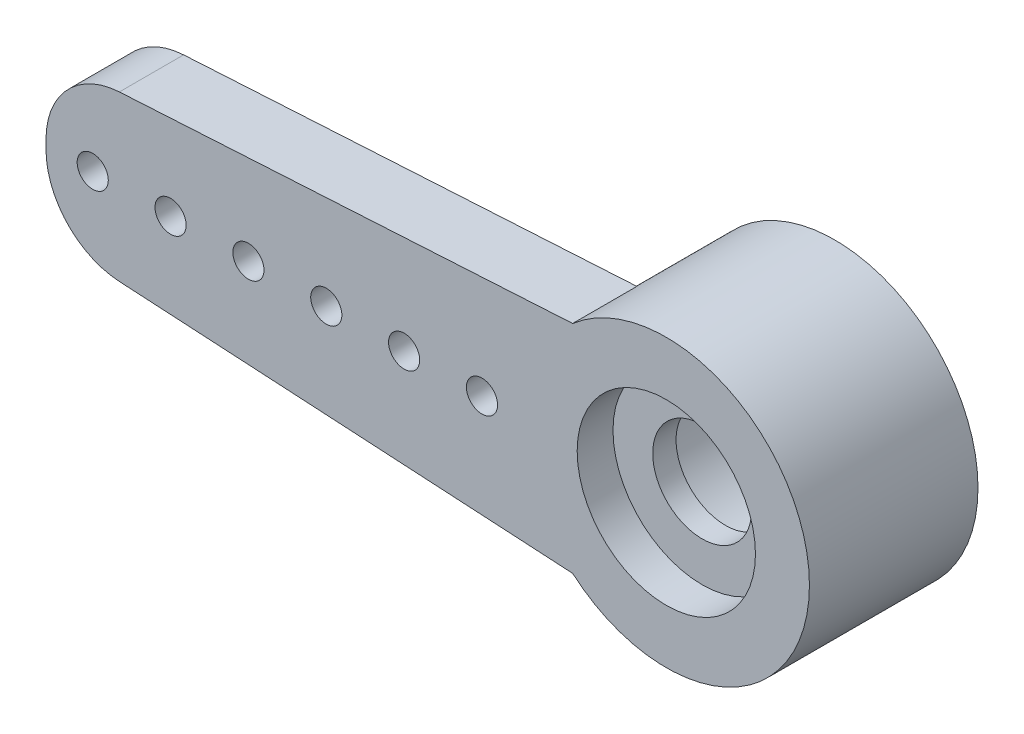
ISO-10303-21;
HEADER;
FILE_DESCRIPTION(('STEP AP214'),'2;1');
FILE_NAME('part.step','',(''),(''),'','','');
FILE_SCHEMA(('AUTOMOTIVE_DESIGN { 1 0 10303 214 1 1 1 1 }'));
ENDSEC;
DATA;
#1=APPLICATION_CONTEXT('core data for automotive mechanical design processes');
#2=APPLICATION_PROTOCOL_DEFINITION('international standard','automotive_design',2000,#1);
#3=PRODUCT_CONTEXT('',#1,'mechanical');
#4=PRODUCT('Part','Part','',(#3));
#5=PRODUCT_RELATED_PRODUCT_CATEGORY('part','',(#4));
#6=PRODUCT_DEFINITION_FORMATION('','',#4);
#7=PRODUCT_DEFINITION_CONTEXT('part definition',#1,'design');
#8=PRODUCT_DEFINITION('design','',#6,#7);
#9=PRODUCT_DEFINITION_SHAPE('','',#8);
#10=(LENGTH_UNIT() NAMED_UNIT(*) SI_UNIT(.MILLI.,.METRE.));
#11=(NAMED_UNIT(*) PLANE_ANGLE_UNIT() SI_UNIT($,.RADIAN.));
#12=(NAMED_UNIT(*) SI_UNIT($,.STERADIAN.) SOLID_ANGLE_UNIT());
#13=UNCERTAINTY_MEASURE_WITH_UNIT(LENGTH_MEASURE(1.E-05),#10,'distance_accuracy_value','');
#14=(GEOMETRIC_REPRESENTATION_CONTEXT(3) GLOBAL_UNCERTAINTY_ASSIGNED_CONTEXT((#13)) GLOBAL_UNIT_ASSIGNED_CONTEXT((#10,
#11,#12)) REPRESENTATION_CONTEXT('',''));
#15=CARTESIAN_POINT('',(0.,0.,0.));
#16=DIRECTION('',(0.,0.,1.));
#17=DIRECTION('',(1.,0.,0.));
#18=AXIS2_PLACEMENT_3D('',#15,#16,#17);
#19=CARTESIAN_POINT('',(0.,0.,4.33));
#20=DIRECTION('',(0.,0.,-1.));
#21=DIRECTION('',(-1.,0.,0.));
#22=AXIS2_PLACEMENT_3D('',#19,#20,#21);
#23=CYLINDRICAL_SURFACE('',#22,3.67665);
#24=CARTESIAN_POINT('',(0.,0.,2.68));
#25=DIRECTION('',(0.,0.,1.));
#26=DIRECTION('',(1.,0.,0.));
#27=AXIS2_PLACEMENT_3D('',#24,#25,#26);
#28=CIRCLE('',#27,3.67665);
#29=CARTESIAN_POINT('',(-2.40610789918075,2.78,2.68));
#30=VERTEX_POINT('',#29);
#31=CARTESIAN_POINT('',(-2.40610789918075,-2.78,2.68));
#32=VERTEX_POINT('',#31);
#33=EDGE_CURVE('E98',#30,#32,#28,.T.);
#34=ORIENTED_EDGE('',*,*,#33,.F.);
#35=DIRECTION('',(0.,0.,1.));
#36=VECTOR('',#35,1.);
#37=CARTESIAN_POINT('',(-2.40610789918075,2.78,2.68));
#38=LINE('',#37,#36);
#39=CARTESIAN_POINT('',(-2.40610789918075,2.78,4.33));
#40=VERTEX_POINT('',#39);
#41=EDGE_CURVE('E110',#30,#40,#38,.T.);
#42=ORIENTED_EDGE('',*,*,#41,.T.);
#43=CARTESIAN_POINT('',(0.,0.,4.33));
#44=DIRECTION('',(0.,0.,1.));
#45=DIRECTION('',(1.,0.,0.));
#46=AXIS2_PLACEMENT_3D('',#43,#44,#45);
#47=CIRCLE('',#46,3.67665);
#48=CARTESIAN_POINT('',(-2.40610789918075,-2.78,4.33));
#49=VERTEX_POINT('',#48);
#50=EDGE_CURVE('E109',#49,#40,#47,.T.);
#51=ORIENTED_EDGE('',*,*,#50,.F.);
#52=DIRECTION('',(0.,0.,1.));
#53=VECTOR('',#52,1.);
#54=CARTESIAN_POINT('',(-2.40610789918075,-2.78,2.68));
#55=LINE('',#54,#53);
#56=EDGE_CURVE('E95',#32,#49,#55,.T.);
#57=ORIENTED_EDGE('',*,*,#56,.F.);
#58=EDGE_LOOP('',(#34,#42,#51,#57));
#59=FACE_BOUND('',#58,.T.);
#60=CARTESIAN_POINT('',(0.,0.,0.));
#61=DIRECTION('',(0.,0.,1.));
#62=DIRECTION('',(1.,0.,0.));
#63=AXIS2_PLACEMENT_3D('',#60,#61,#62);
#64=CIRCLE('',#63,3.67665);
#65=CARTESIAN_POINT('',(3.67665,0.,0.));
#66=VERTEX_POINT('',#65);
#67=EDGE_CURVE('E132',#66,#66,#64,.T.);
#68=ORIENTED_EDGE('',*,*,#67,.T.);
#69=EDGE_LOOP('',(#68));
#70=FACE_BOUND('',#69,.T.);
#71=ADVANCED_FACE('F35',(#59,#70),#23,.T.);
#72=CARTESIAN_POINT('',(0.,0.,4.33));
#73=DIRECTION('',(0.,0.,1.));
#74=DIRECTION('',(1.,0.,0.));
#75=AXIS2_PLACEMENT_3D('',#72,#73,#74);
#76=PLANE('',#75);
#77=CARTESIAN_POINT('',(-4.735,0.,4.33));
#78=DIRECTION('',(0.,0.,1.));
#79=DIRECTION('',(1.,0.,0.));
#80=AXIS2_PLACEMENT_3D('',#77,#78,#79);
#81=CIRCLE('',#80,0.4);
#82=CARTESIAN_POINT('',(-4.335,0.,4.33));
#83=VERTEX_POINT('',#82);
#84=EDGE_CURVE('E178',#83,#83,#81,.T.);
#85=ORIENTED_EDGE('',*,*,#84,.F.);
#86=EDGE_LOOP('',(#85));
#87=FACE_BOUND('',#86,.T.);
#88=CARTESIAN_POINT('',(-6.735,0.,4.33));
#89=DIRECTION('',(0.,0.,1.));
#90=DIRECTION('',(1.,0.,0.));
#91=AXIS2_PLACEMENT_3D('',#88,#89,#90);
#92=CIRCLE('',#91,0.4);
#93=CARTESIAN_POINT('',(-6.335,0.,4.33));
#94=VERTEX_POINT('',#93);
#95=EDGE_CURVE('E168',#94,#94,#92,.T.);
#96=ORIENTED_EDGE('',*,*,#95,.F.);
#97=EDGE_LOOP('',(#96));
#98=FACE_BOUND('',#97,.T.);
#99=CARTESIAN_POINT('',(-8.735,0.,4.33));
#100=DIRECTION('',(0.,0.,1.));
#101=DIRECTION('',(1.,0.,0.));
#102=AXIS2_PLACEMENT_3D('',#99,#100,#101);
#103=CIRCLE('',#102,0.400000000000001);
#104=CARTESIAN_POINT('',(-8.335,0.,4.33));
#105=VERTEX_POINT('',#104);
#106=EDGE_CURVE('E165',#105,#105,#103,.T.);
#107=ORIENTED_EDGE('',*,*,#106,.F.);
#108=EDGE_LOOP('',(#107));
#109=FACE_BOUND('',#108,.T.);
#110=CARTESIAN_POINT('',(-10.735,0.,4.33));
#111=DIRECTION('',(0.,0.,1.));
#112=DIRECTION('',(1.,0.,0.));
#113=AXIS2_PLACEMENT_3D('',#110,#111,#112);
#114=CIRCLE('',#113,0.4);
#115=CARTESIAN_POINT('',(-10.335,0.,4.33));
#116=VERTEX_POINT('',#115);
#117=EDGE_CURVE('E162',#116,#116,#114,.T.);
#118=ORIENTED_EDGE('',*,*,#117,.F.);
#119=EDGE_LOOP('',(#118));
#120=FACE_BOUND('',#119,.T.);
#121=CARTESIAN_POINT('',(-12.735,0.,4.33));
#122=DIRECTION('',(0.,0.,1.));
#123=DIRECTION('',(1.,0.,0.));
#124=AXIS2_PLACEMENT_3D('',#121,#122,#123);
#125=CIRCLE('',#124,0.4);
#126=CARTESIAN_POINT('',(-12.335,0.,4.33));
#127=VERTEX_POINT('',#126);
#128=EDGE_CURVE('E158',#127,#127,#125,.T.);
#129=ORIENTED_EDGE('',*,*,#128,.F.);
#130=EDGE_LOOP('',(#129));
#131=FACE_BOUND('',#130,.T.);
#132=CARTESIAN_POINT('',(-14.735,0.,4.33));
#133=DIRECTION('',(0.,0.,1.));
#134=DIRECTION('',(1.,0.,0.));
#135=AXIS2_PLACEMENT_3D('',#132,#133,#134);
#136=CIRCLE('',#135,0.4);
#137=CARTESIAN_POINT('',(-14.335,0.,4.33));
#138=VERTEX_POINT('',#137);
#139=EDGE_CURVE('E154',#138,#138,#136,.T.);
#140=ORIENTED_EDGE('',*,*,#139,.F.);
#141=EDGE_LOOP('',(#140));
#142=FACE_BOUND('',#141,.T.);
#143=CARTESIAN_POINT('',(0.,0.,4.33));
#144=DIRECTION('',(0.,0.,1.));
#145=DIRECTION('',(1.,0.,0.));
#146=AXIS2_PLACEMENT_3D('',#143,#144,#145);
#147=CIRCLE('',#146,2.29);
#148=CARTESIAN_POINT('',(2.29,0.,4.33));
#149=VERTEX_POINT('',#148);
#150=EDGE_CURVE('E122',#149,#149,#147,.T.);
#151=ORIENTED_EDGE('',*,*,#150,.F.);
#152=EDGE_LOOP('',(#151));
#153=FACE_BOUND('',#152,.T.);
#154=DIRECTION('',(0.,-1.,0.));
#155=VECTOR('',#154,1.);
#156=CARTESIAN_POINT('',(-15.935,0.,4.33));
#157=LINE('',#156,#155);
#158=CARTESIAN_POINT('',(-15.935,0.111987506035679,4.33));
#159=VERTEX_POINT('',#158);
#160=CARTESIAN_POINT('',(-15.935,-0.111987506035682,4.33));
#161=VERTEX_POINT('',#160);
#162=EDGE_CURVE('E153',#159,#161,#157,.T.);
#163=ORIENTED_EDGE('',*,*,#162,.T.);
#164=CARTESIAN_POINT('',(-13.935,-0.111987506035682,4.33));
#165=DIRECTION('',(0.,0.,1.));
#166=DIRECTION('',(1.,0.,0.));
#167=AXIS2_PLACEMENT_3D('',#164,#165,#166);
#168=CIRCLE('',#167,2.);
#169=CARTESIAN_POINT('',(-14.0501176084538,-2.10867174151807,4.33));
#170=VERTEX_POINT('',#169);
#171=EDGE_CURVE('E145',#161,#170,#168,.T.);
#172=ORIENTED_EDGE('',*,*,#171,.T.);
#173=DIRECTION('',(0.998342117741192,-0.0575588042269161,0.));
#174=VECTOR('',#173,1.);
#175=CARTESIAN_POINT('',(-0.167719666081258,-2.90905290461381,4.33));
#176=LINE('',#175,#174);
#177=EDGE_CURVE('E192',#170,#49,#176,.T.);
#178=ORIENTED_EDGE('',*,*,#177,.T.);
#179=ORIENTED_EDGE('',*,*,#50,.T.);
#180=DIRECTION('',(-0.998342117741192,-0.0575588042269164,0.));
#181=VECTOR('',#180,1.);
#182=CARTESIAN_POINT('',(-0.167719666081259,2.90905290461381,4.33));
#183=LINE('',#182,#181);
#184=CARTESIAN_POINT('',(-14.0501176084538,2.10867174151806,4.33));
#185=VERTEX_POINT('',#184);
#186=EDGE_CURVE('E188',#40,#185,#183,.T.);
#187=ORIENTED_EDGE('',*,*,#186,.T.);
#188=CARTESIAN_POINT('',(-13.935,0.111987506035679,4.33));
#189=DIRECTION('',(0.,0.,1.));
#190=DIRECTION('',(1.,0.,0.));
#191=AXIS2_PLACEMENT_3D('',#188,#189,#190);
#192=CIRCLE('',#191,2.);
#193=EDGE_CURVE('E143',#185,#159,#192,.T.);
#194=ORIENTED_EDGE('',*,*,#193,.T.);
#195=EDGE_LOOP('',(#163,#172,#178,#179,#187,#194));
#196=FACE_BOUND('',#195,.T.);
#197=ADVANCED_FACE('F195',(#87,#98,#109,#120,#131,#142,#153,#196),#76,.T.);
#198=CARTESIAN_POINT('',(0.,0.,0.));
#199=DIRECTION('',(0.,0.,1.));
#200=DIRECTION('',(1.,0.,0.));
#201=AXIS2_PLACEMENT_3D('',#198,#199,#200);
#202=PLANE('',#201);
#203=CARTESIAN_POINT('',(0.,0.,0.));
#204=DIRECTION('',(0.,0.,-1.));
#205=DIRECTION('',(-1.,0.,0.));
#206=AXIS2_PLACEMENT_3D('',#203,#204,#205);
#207=CIRCLE('',#206,2.235);
#208=CARTESIAN_POINT('',(-2.235,0.,0.));
#209=VERTEX_POINT('',#208);
#210=EDGE_CURVE('E126',#209,#209,#207,.T.);
#211=ORIENTED_EDGE('',*,*,#210,.F.);
#212=EDGE_LOOP('',(#211));
#213=FACE_BOUND('',#212,.T.);
#214=ORIENTED_EDGE('',*,*,#67,.F.);
#215=EDGE_LOOP('',(#214));
#216=FACE_BOUND('',#215,.T.);
#217=ADVANCED_FACE('F220',(#213,#216),#202,.F.);
#218=CARTESIAN_POINT('',(0.,0.,2.81));
#219=DIRECTION('',(0.,0.,-1.));
#220=DIRECTION('',(-1.,0.,0.));
#221=AXIS2_PLACEMENT_3D('',#218,#219,#220);
#222=CYLINDRICAL_SURFACE('',#221,2.235);
#223=CARTESIAN_POINT('',(0.,0.,2.81));
#224=DIRECTION('',(0.,0.,-1.));
#225=DIRECTION('',(-1.,0.,0.));
#226=AXIS2_PLACEMENT_3D('',#223,#224,#225);
#227=CIRCLE('',#226,2.235);
#228=CARTESIAN_POINT('',(-2.235,0.,2.81));
#229=VERTEX_POINT('',#228);
#230=EDGE_CURVE('E129',#229,#229,#227,.T.);
#231=ORIENTED_EDGE('',*,*,#230,.F.);
#232=EDGE_LOOP('',(#231));
#233=FACE_BOUND('',#232,.T.);
#234=ORIENTED_EDGE('',*,*,#210,.T.);
#235=EDGE_LOOP('',(#234));
#236=FACE_BOUND('',#235,.T.);
#237=ADVANCED_FACE('F225',(#233,#236),#222,.F.);
#238=CARTESIAN_POINT('',(0.,0.,2.81));
#239=DIRECTION('',(0.,0.,-1.));
#240=DIRECTION('',(-1.,0.,0.));
#241=AXIS2_PLACEMENT_3D('',#238,#239,#240);
#242=PLANE('',#241);
#243=CARTESIAN_POINT('',(0.,0.,2.81));
#244=DIRECTION('',(0.,0.,-1.));
#245=DIRECTION('',(-1.,0.,0.));
#246=AXIS2_PLACEMENT_3D('',#243,#244,#245);
#247=CIRCLE('',#246,1.27);
#248=CARTESIAN_POINT('',(1.27,0.,2.81));
#249=VERTEX_POINT('',#248);
#250=EDGE_CURVE('E119',#249,#249,#247,.T.);
#251=ORIENTED_EDGE('',*,*,#250,.F.);
#252=EDGE_LOOP('',(#251));
#253=FACE_BOUND('',#252,.T.);
#254=ORIENTED_EDGE('',*,*,#230,.T.);
#255=EDGE_LOOP('',(#254));
#256=FACE_BOUND('',#255,.T.);
#257=ADVANCED_FACE('F230',(#253,#256),#242,.T.);
#258=CARTESIAN_POINT('',(0.,0.,3.41));
#259=DIRECTION('',(0.,0.,1.));
#260=DIRECTION('',(1.,0.,0.));
#261=AXIS2_PLACEMENT_3D('',#258,#259,#260);
#262=CYLINDRICAL_SURFACE('',#261,2.29);
#263=CARTESIAN_POINT('',(0.,0.,3.41));
#264=DIRECTION('',(0.,0.,1.));
#265=DIRECTION('',(1.,0.,0.));
#266=AXIS2_PLACEMENT_3D('',#263,#264,#265);
#267=CIRCLE('',#266,2.29);
#268=CARTESIAN_POINT('',(2.29,0.,3.41));
#269=VERTEX_POINT('',#268);
#270=EDGE_CURVE('E123',#269,#269,#267,.T.);
#271=ORIENTED_EDGE('',*,*,#270,.F.);
#272=EDGE_LOOP('',(#271));
#273=FACE_BOUND('',#272,.T.);
#274=ORIENTED_EDGE('',*,*,#150,.T.);
#275=EDGE_LOOP('',(#274));
#276=FACE_BOUND('',#275,.T.);
#277=ADVANCED_FACE('F234',(#273,#276),#262,.F.);
#278=CARTESIAN_POINT('',(0.,0.,3.41));
#279=DIRECTION('',(0.,0.,1.));
#280=DIRECTION('',(1.,0.,0.));
#281=AXIS2_PLACEMENT_3D('',#278,#279,#280);
#282=PLANE('',#281);
#283=CARTESIAN_POINT('',(0.,0.,3.41));
#284=DIRECTION('',(0.,0.,1.));
#285=DIRECTION('',(1.,0.,0.));
#286=AXIS2_PLACEMENT_3D('',#283,#284,#285);
#287=CIRCLE('',#286,1.27);
#288=CARTESIAN_POINT('',(1.27,0.,3.41));
#289=VERTEX_POINT('',#288);
#290=EDGE_CURVE('E112',#289,#289,#287,.T.);
#291=ORIENTED_EDGE('',*,*,#290,.F.);
#292=EDGE_LOOP('',(#291));
#293=FACE_BOUND('',#292,.T.);
#294=ORIENTED_EDGE('',*,*,#270,.T.);
#295=EDGE_LOOP('',(#294));
#296=FACE_BOUND('',#295,.T.);
#297=ADVANCED_FACE('F238',(#293,#296),#282,.T.);
#298=CARTESIAN_POINT('',(0.,0.,0.));
#299=DIRECTION('',(0.,0.,1.));
#300=DIRECTION('',(1.,0.,0.));
#301=AXIS2_PLACEMENT_3D('',#298,#299,#300);
#302=CYLINDRICAL_SURFACE('',#301,1.27);
#303=CARTESIAN_POINT('',(1.27,0.,2.81));
#304=CARTESIAN_POINT('',(1.27,0.,2.81625));
#305=CARTESIAN_POINT('',(1.27,0.,2.8225));
#306=CARTESIAN_POINT('',(1.27,0.,2.835));
#307=CARTESIAN_POINT('',(1.27,0.,2.84125));
#308=CARTESIAN_POINT('',(1.27,0.,2.85375));
#309=CARTESIAN_POINT('',(1.27,0.,2.86));
#310=CARTESIAN_POINT('',(1.27,0.,2.8725));
#311=CARTESIAN_POINT('',(1.27,0.,2.87875));
#312=CARTESIAN_POINT('',(1.27,0.,2.89125));
#313=CARTESIAN_POINT('',(1.27,0.,2.8975));
#314=CARTESIAN_POINT('',(1.27,0.,2.91));
#315=CARTESIAN_POINT('',(1.27,0.,2.91625));
#316=CARTESIAN_POINT('',(1.27,0.,2.92875));
#317=CARTESIAN_POINT('',(1.27,0.,2.935));
#318=CARTESIAN_POINT('',(1.27,0.,2.9475));
#319=CARTESIAN_POINT('',(1.27,0.,2.95375));
#320=CARTESIAN_POINT('',(1.27,0.,2.96625));
#321=CARTESIAN_POINT('',(1.27,0.,2.9725));
#322=CARTESIAN_POINT('',(1.27,0.,2.985));
#323=CARTESIAN_POINT('',(1.27,0.,2.99125));
#324=CARTESIAN_POINT('',(1.27,0.,3.00375));
#325=CARTESIAN_POINT('',(1.27,0.,3.01));
#326=CARTESIAN_POINT('',(1.27,0.,3.0225));
#327=CARTESIAN_POINT('',(1.27,0.,3.02875));
#328=CARTESIAN_POINT('',(1.27,0.,3.04125));
#329=CARTESIAN_POINT('',(1.27,0.,3.0475));
#330=CARTESIAN_POINT('',(1.27,0.,3.06));
#331=CARTESIAN_POINT('',(1.27,0.,3.06625));
#332=CARTESIAN_POINT('',(1.27,0.,3.07875));
#333=CARTESIAN_POINT('',(1.27,0.,3.085));
#334=CARTESIAN_POINT('',(1.27,0.,3.0975));
#335=CARTESIAN_POINT('',(1.27,0.,3.10375));
#336=CARTESIAN_POINT('',(1.27,0.,3.11625));
#337=CARTESIAN_POINT('',(1.27,0.,3.1225));
#338=CARTESIAN_POINT('',(1.27,0.,3.135));
#339=CARTESIAN_POINT('',(1.27,0.,3.14125));
#340=CARTESIAN_POINT('',(1.27,0.,3.15375));
#341=CARTESIAN_POINT('',(1.27,0.,3.16));
#342=CARTESIAN_POINT('',(1.27,0.,3.1725));
#343=CARTESIAN_POINT('',(1.27,0.,3.17875));
#344=CARTESIAN_POINT('',(1.27,0.,3.19125));
#345=CARTESIAN_POINT('',(1.27,0.,3.1975));
#346=CARTESIAN_POINT('',(1.27,0.,3.21));
#347=CARTESIAN_POINT('',(1.27,0.,3.21625));
#348=CARTESIAN_POINT('',(1.27,0.,3.22875));
#349=CARTESIAN_POINT('',(1.27,0.,3.235));
#350=CARTESIAN_POINT('',(1.27,0.,3.2475));
#351=CARTESIAN_POINT('',(1.27,0.,3.25375));
#352=CARTESIAN_POINT('',(1.27,0.,3.26625));
#353=CARTESIAN_POINT('',(1.27,0.,3.2725));
#354=CARTESIAN_POINT('',(1.27,0.,3.285));
#355=CARTESIAN_POINT('',(1.27,0.,3.29125));
#356=CARTESIAN_POINT('',(1.27,0.,3.30375));
#357=CARTESIAN_POINT('',(1.27,0.,3.31));
#358=CARTESIAN_POINT('',(1.27,0.,3.3225));
#359=CARTESIAN_POINT('',(1.27,0.,3.32875));
#360=CARTESIAN_POINT('',(1.27,0.,3.34125));
#361=CARTESIAN_POINT('',(1.27,0.,3.3475));
#362=CARTESIAN_POINT('',(1.27,0.,3.36));
#363=CARTESIAN_POINT('',(1.27,0.,3.36625));
#364=CARTESIAN_POINT('',(1.27,0.,3.37875));
#365=CARTESIAN_POINT('',(1.27,0.,3.385));
#366=CARTESIAN_POINT('',(1.27,0.,3.3975));
#367=CARTESIAN_POINT('',(1.27,0.,3.40375));
#368=CARTESIAN_POINT('',(1.27,0.,3.41));
#369=B_SPLINE_CURVE_WITH_KNOTS('',3,(#303,#304,#305,#306,#307,#308,#309,#310,#311,#312,#313,
#314,#315,#316,#317,#318,#319,#320,#321,#322,#323,#324,#325,#326,#327,#328,#329,#330,#331,#332,
#333,#334,#335,#336,#337,#338,#339,#340,#341,#342,#343,#344,#345,#346,#347,#348,#349,#350,#351,
#352,#353,#354,#355,#356,#357,#358,#359,#360,#361,#362,#363,#364,#365,#366,#367,#368),
.UNSPECIFIED.,.F.,.F.,(4,2,2,2,2,2,2,2,2,2,2,2,2,2,2,2,2,2,2,2,2,2,2,2,2,2,2,2,2,2,2,2,4),(0.,
0.0187500000000001,0.0374999999999998,0.0562499999999999,0.075,0.0937499999999997,0.1125,
0.13125,0.15,0.16875,0.1875,0.20625,0.225,0.24375,0.2625,0.281249999999999,0.299999999999999,
0.31875,0.337499999999999,0.356249999999999,0.374999999999999,0.393749999999999,
0.412499999999999,0.431249999999999,0.449999999999999,0.468749999999999,0.487499999999999,
0.506249999999999,0.524999999999999,0.543749999999999,0.562499999999999,0.581249999999999,
0.599999999999999),.UNSPECIFIED.);
#370=EDGE_CURVE('BSEAM242',#249,#289,#369,.T.);
#371=ORIENTED_EDGE('',*,*,#250,.T.);
#372=ORIENTED_EDGE('',*,*,#290,.T.);
#373=ORIENTED_EDGE('',*,*,#370,.T.);
#374=ORIENTED_EDGE('',*,*,#370,.F.);
#375=EDGE_LOOP('',(#371,#373,#372,#374));
#376=FACE_BOUND('',#375,.T.);
#377=ADVANCED_FACE('F242',(#376),#302,.F.);
#378=CARTESIAN_POINT('',(-15.935,0.,2.68));
#379=DIRECTION('',(-1.,0.,0.));
#380=DIRECTION('',(0.,0.,1.));
#381=AXIS2_PLACEMENT_3D('',#378,#379,#380);
#382=PLANE('',#381);
#383=DIRECTION('',(0.,-1.,0.));
#384=VECTOR('',#383,1.);
#385=CARTESIAN_POINT('',(-15.935,0.,2.68));
#386=LINE('',#385,#384);
#387=CARTESIAN_POINT('',(-15.935,0.111987506035679,2.68));
#388=VERTEX_POINT('',#387);
#389=CARTESIAN_POINT('',(-15.935,-0.111987506035682,2.68));
#390=VERTEX_POINT('',#389);
#391=EDGE_CURVE('E99',#388,#390,#386,.T.);
#392=ORIENTED_EDGE('',*,*,#391,.T.);
#393=DIRECTION('',(0.,0.,1.));
#394=VECTOR('',#393,1.);
#395=CARTESIAN_POINT('',(-15.935,-0.111987506035682,2.68));
#396=LINE('',#395,#394);
#397=EDGE_CURVE('E140',#390,#161,#396,.T.);
#398=ORIENTED_EDGE('',*,*,#397,.T.);
#399=ORIENTED_EDGE('',*,*,#162,.F.);
#400=DIRECTION('',(0.,0.,1.));
#401=VECTOR('',#400,1.);
#402=CARTESIAN_POINT('',(-15.935,0.111987506035679,2.68));
#403=LINE('',#402,#401);
#404=EDGE_CURVE('E136',#159,#388,#403,.F.);
#405=ORIENTED_EDGE('',*,*,#404,.T.);
#406=EDGE_LOOP('',(#392,#398,#399,#405));
#407=FACE_BOUND('',#406,.T.);
#408=ADVANCED_FACE('F203',(#407),#382,.T.);
#409=CARTESIAN_POINT('',(-0.167719666081259,2.90905290461381,2.68));
#410=DIRECTION('',(-0.0575588042269164,0.998342117741192,0.));
#411=DIRECTION('',(-0.998342117741192,-0.0575588042269164,0.));
#412=AXIS2_PLACEMENT_3D('',#409,#410,#411);
#413=PLANE('',#412);
#414=DIRECTION('',(-0.998342117741192,-0.0575588042269164,0.));
#415=VECTOR('',#414,1.);
#416=CARTESIAN_POINT('',(-0.167719666081259,2.90905290461381,2.68));
#417=LINE('',#416,#415);
#418=CARTESIAN_POINT('',(-14.0501176084538,2.10867174151806,2.68));
#419=VERTEX_POINT('',#418);
#420=EDGE_CURVE('E103',#30,#419,#417,.T.);
#421=ORIENTED_EDGE('',*,*,#420,.T.);
#422=DIRECTION('',(0.,0.,1.));
#423=VECTOR('',#422,1.);
#424=CARTESIAN_POINT('',(-14.0501176084538,2.10867174151806,2.68));
#425=LINE('',#424,#423);
#426=EDGE_CURVE('E11',#419,#185,#425,.T.);
#427=ORIENTED_EDGE('',*,*,#426,.T.);
#428=ORIENTED_EDGE('',*,*,#186,.F.);
#429=ORIENTED_EDGE('',*,*,#41,.F.);
#430=EDGE_LOOP('',(#421,#427,#428,#429));
#431=FACE_BOUND('',#430,.T.);
#432=ADVANCED_FACE('F198',(#431),#413,.T.);
#433=CARTESIAN_POINT('',(-0.167719666081258,-2.90905290461381,2.68));
#434=DIRECTION('',(-0.0575588042269161,-0.998342117741192,0.));
#435=DIRECTION('',(0.998342117741192,-0.0575588042269161,0.));
#436=AXIS2_PLACEMENT_3D('',#433,#434,#435);
#437=PLANE('',#436);
#438=ORIENTED_EDGE('',*,*,#177,.F.);
#439=DIRECTION('',(0.,0.,1.));
#440=VECTOR('',#439,1.);
#441=CARTESIAN_POINT('',(-14.0501176084538,-2.10867174151807,2.68));
#442=LINE('',#441,#440);
#443=CARTESIAN_POINT('',(-14.0501176084538,-2.10867174151807,2.68));
#444=VERTEX_POINT('',#443);
#445=EDGE_CURVE('E60',#170,#444,#442,.F.);
#446=ORIENTED_EDGE('',*,*,#445,.T.);
#447=DIRECTION('',(0.998342117741192,-0.0575588042269161,0.));
#448=VECTOR('',#447,1.);
#449=CARTESIAN_POINT('',(-0.167719666081258,-2.90905290461381,2.68));
#450=LINE('',#449,#448);
#451=EDGE_CURVE('E91',#444,#32,#450,.T.);
#452=ORIENTED_EDGE('',*,*,#451,.T.);
#453=ORIENTED_EDGE('',*,*,#56,.T.);
#454=EDGE_LOOP('',(#438,#446,#452,#453));
#455=FACE_BOUND('',#454,.T.);
#456=ADVANCED_FACE('F93',(#455),#437,.T.);
#457=CARTESIAN_POINT('',(0.,0.,2.68));
#458=DIRECTION('',(0.,0.,1.));
#459=DIRECTION('',(1.,0.,0.));
#460=AXIS2_PLACEMENT_3D('',#457,#458,#459);
#461=PLANE('',#460);
#462=CARTESIAN_POINT('',(-4.735,0.,2.68));
#463=DIRECTION('',(0.,0.,1.));
#464=DIRECTION('',(1.,0.,0.));
#465=AXIS2_PLACEMENT_3D('',#462,#463,#464);
#466=CIRCLE('',#465,0.4);
#467=CARTESIAN_POINT('',(-4.335,0.,2.68));
#468=VERTEX_POINT('',#467);
#469=EDGE_CURVE('E39',#468,#468,#466,.T.);
#470=ORIENTED_EDGE('',*,*,#469,.T.);
#471=EDGE_LOOP('',(#470));
#472=FACE_BOUND('',#471,.T.);
#473=CARTESIAN_POINT('',(-6.735,0.,2.68));
#474=DIRECTION('',(0.,0.,1.));
#475=DIRECTION('',(1.,0.,0.));
#476=AXIS2_PLACEMENT_3D('',#473,#474,#475);
#477=CIRCLE('',#476,0.4);
#478=CARTESIAN_POINT('',(-6.335,0.,2.68));
#479=VERTEX_POINT('',#478);
#480=EDGE_CURVE('E166',#479,#479,#477,.T.);
#481=ORIENTED_EDGE('',*,*,#480,.T.);
#482=EDGE_LOOP('',(#481));
#483=FACE_BOUND('',#482,.T.);
#484=CARTESIAN_POINT('',(-8.735,0.,2.68));
#485=DIRECTION('',(0.,0.,1.));
#486=DIRECTION('',(1.,0.,0.));
#487=AXIS2_PLACEMENT_3D('',#484,#485,#486);
#488=CIRCLE('',#487,0.400000000000001);
#489=CARTESIAN_POINT('',(-8.335,0.,2.68));
#490=VERTEX_POINT('',#489);
#491=EDGE_CURVE('E163',#490,#490,#488,.T.);
#492=ORIENTED_EDGE('',*,*,#491,.T.);
#493=EDGE_LOOP('',(#492));
#494=FACE_BOUND('',#493,.T.);
#495=CARTESIAN_POINT('',(-10.735,0.,2.68));
#496=DIRECTION('',(0.,0.,1.));
#497=DIRECTION('',(1.,0.,0.));
#498=AXIS2_PLACEMENT_3D('',#495,#496,#497);
#499=CIRCLE('',#498,0.4);
#500=CARTESIAN_POINT('',(-10.335,0.,2.68));
#501=VERTEX_POINT('',#500);
#502=EDGE_CURVE('E159',#501,#501,#499,.T.);
#503=ORIENTED_EDGE('',*,*,#502,.T.);
#504=EDGE_LOOP('',(#503));
#505=FACE_BOUND('',#504,.T.);
#506=CARTESIAN_POINT('',(-12.735,0.,2.68));
#507=DIRECTION('',(0.,0.,1.));
#508=DIRECTION('',(1.,0.,0.));
#509=AXIS2_PLACEMENT_3D('',#506,#507,#508);
#510=CIRCLE('',#509,0.4);
#511=CARTESIAN_POINT('',(-12.335,0.,2.68));
#512=VERTEX_POINT('',#511);
#513=EDGE_CURVE('E155',#512,#512,#510,.T.);
#514=ORIENTED_EDGE('',*,*,#513,.T.);
#515=EDGE_LOOP('',(#514));
#516=FACE_BOUND('',#515,.T.);
#517=CARTESIAN_POINT('',(-14.735,0.,2.68));
#518=DIRECTION('',(0.,0.,1.));
#519=DIRECTION('',(1.,0.,0.));
#520=AXIS2_PLACEMENT_3D('',#517,#518,#519);
#521=CIRCLE('',#520,0.4);
#522=CARTESIAN_POINT('',(-14.335,0.,2.68));
#523=VERTEX_POINT('',#522);
#524=EDGE_CURVE('E150',#523,#523,#521,.T.);
#525=ORIENTED_EDGE('',*,*,#524,.T.);
#526=EDGE_LOOP('',(#525));
#527=FACE_BOUND('',#526,.T.);
#528=ORIENTED_EDGE('',*,*,#451,.F.);
#529=CARTESIAN_POINT('',(-13.935,-0.111987506035682,2.68));
#530=DIRECTION('',(0.,0.,1.));
#531=DIRECTION('',(1.,0.,0.));
#532=AXIS2_PLACEMENT_3D('',#529,#530,#531);
#533=CIRCLE('',#532,2.);
#534=EDGE_CURVE('E44',#444,#390,#533,.F.);
#535=ORIENTED_EDGE('',*,*,#534,.T.);
#536=ORIENTED_EDGE('',*,*,#391,.F.);
#537=CARTESIAN_POINT('',(-13.935,0.111987506035679,2.68));
#538=DIRECTION('',(0.,0.,1.));
#539=DIRECTION('',(1.,0.,0.));
#540=AXIS2_PLACEMENT_3D('',#537,#538,#539);
#541=CIRCLE('',#540,2.);
#542=EDGE_CURVE('E52',#388,#419,#541,.F.);
#543=ORIENTED_EDGE('',*,*,#542,.T.);
#544=ORIENTED_EDGE('',*,*,#420,.F.);
#545=ORIENTED_EDGE('',*,*,#33,.T.);
#546=EDGE_LOOP('',(#528,#535,#536,#543,#544,#545));
#547=FACE_BOUND('',#546,.T.);
#548=ADVANCED_FACE('F102',(#472,#483,#494,#505,#516,#527,#547),#461,.F.);
#549=CARTESIAN_POINT('',(-13.935,-0.111987506035682,2.68));
#550=DIRECTION('',(0.,0.,1.));
#551=DIRECTION('',(1.,0.,0.));
#552=AXIS2_PLACEMENT_3D('',#549,#550,#551);
#553=CYLINDRICAL_SURFACE('',#552,2.);
#554=ORIENTED_EDGE('',*,*,#534,.F.);
#555=ORIENTED_EDGE('',*,*,#445,.F.);
#556=ORIENTED_EDGE('',*,*,#171,.F.);
#557=ORIENTED_EDGE('',*,*,#397,.F.);
#558=EDGE_LOOP('',(#554,#555,#556,#557));
#559=FACE_BOUND('',#558,.T.);
#560=ADVANCED_FACE('F206',(#559),#553,.T.);
#561=CARTESIAN_POINT('',(-13.935,0.111987506035679,2.68));
#562=DIRECTION('',(0.,0.,1.));
#563=DIRECTION('',(1.,0.,0.));
#564=AXIS2_PLACEMENT_3D('',#561,#562,#563);
#565=CYLINDRICAL_SURFACE('',#564,2.);
#566=ORIENTED_EDGE('',*,*,#542,.F.);
#567=ORIENTED_EDGE('',*,*,#404,.F.);
#568=ORIENTED_EDGE('',*,*,#193,.F.);
#569=ORIENTED_EDGE('',*,*,#426,.F.);
#570=EDGE_LOOP('',(#566,#567,#568,#569));
#571=FACE_BOUND('',#570,.T.);
#572=ADVANCED_FACE('F37',(#571),#565,.T.);
#573=CARTESIAN_POINT('',(-14.735,0.,0.));
#574=DIRECTION('',(0.,0.,1.));
#575=DIRECTION('',(1.,0.,0.));
#576=AXIS2_PLACEMENT_3D('',#573,#574,#575);
#577=CYLINDRICAL_SURFACE('',#576,0.4);
#578=ORIENTED_EDGE('',*,*,#139,.T.);
#579=EDGE_LOOP('',(#578));
#580=FACE_BOUND('',#579,.T.);
#581=ORIENTED_EDGE('',*,*,#524,.F.);
#582=EDGE_LOOP('',(#581));
#583=FACE_BOUND('',#582,.T.);
#584=ADVANCED_FACE('F212',(#580,#583),#577,.F.);
#585=CARTESIAN_POINT('',(-12.735,0.,0.));
#586=DIRECTION('',(0.,0.,1.));
#587=DIRECTION('',(1.,0.,0.));
#588=AXIS2_PLACEMENT_3D('',#585,#586,#587);
#589=CYLINDRICAL_SURFACE('',#588,0.4);
#590=ORIENTED_EDGE('',*,*,#128,.T.);
#591=EDGE_LOOP('',(#590));
#592=FACE_BOUND('',#591,.T.);
#593=ORIENTED_EDGE('',*,*,#513,.F.);
#594=EDGE_LOOP('',(#593));
#595=FACE_BOUND('',#594,.T.);
#596=ADVANCED_FACE('F255',(#592,#595),#589,.F.);
#597=CARTESIAN_POINT('',(-10.735,0.,0.));
#598=DIRECTION('',(0.,0.,1.));
#599=DIRECTION('',(1.,0.,0.));
#600=AXIS2_PLACEMENT_3D('',#597,#598,#599);
#601=CYLINDRICAL_SURFACE('',#600,0.4);
#602=ORIENTED_EDGE('',*,*,#117,.T.);
#603=EDGE_LOOP('',(#602));
#604=FACE_BOUND('',#603,.T.);
#605=ORIENTED_EDGE('',*,*,#502,.F.);
#606=EDGE_LOOP('',(#605));
#607=FACE_BOUND('',#606,.T.);
#608=ADVANCED_FACE('F259',(#604,#607),#601,.F.);
#609=CARTESIAN_POINT('',(-8.735,0.,0.));
#610=DIRECTION('',(0.,0.,1.));
#611=DIRECTION('',(1.,0.,0.));
#612=AXIS2_PLACEMENT_3D('',#609,#610,#611);
#613=CYLINDRICAL_SURFACE('',#612,0.400000000000001);
#614=ORIENTED_EDGE('',*,*,#106,.T.);
#615=EDGE_LOOP('',(#614));
#616=FACE_BOUND('',#615,.T.);
#617=ORIENTED_EDGE('',*,*,#491,.F.);
#618=EDGE_LOOP('',(#617));
#619=FACE_BOUND('',#618,.T.);
#620=ADVANCED_FACE('F263',(#616,#619),#613,.F.);
#621=CARTESIAN_POINT('',(-6.735,0.,0.));
#622=DIRECTION('',(0.,0.,1.));
#623=DIRECTION('',(1.,0.,0.));
#624=AXIS2_PLACEMENT_3D('',#621,#622,#623);
#625=CYLINDRICAL_SURFACE('',#624,0.4);
#626=ORIENTED_EDGE('',*,*,#95,.T.);
#627=EDGE_LOOP('',(#626));
#628=FACE_BOUND('',#627,.T.);
#629=ORIENTED_EDGE('',*,*,#480,.F.);
#630=EDGE_LOOP('',(#629));
#631=FACE_BOUND('',#630,.T.);
#632=ADVANCED_FACE('F267',(#628,#631),#625,.F.);
#633=CARTESIAN_POINT('',(-4.735,0.,0.));
#634=DIRECTION('',(0.,0.,1.));
#635=DIRECTION('',(1.,0.,0.));
#636=AXIS2_PLACEMENT_3D('',#633,#634,#635);
#637=CYLINDRICAL_SURFACE('',#636,0.4);
#638=ORIENTED_EDGE('',*,*,#84,.T.);
#639=EDGE_LOOP('',(#638));
#640=FACE_BOUND('',#639,.T.);
#641=ORIENTED_EDGE('',*,*,#469,.F.);
#642=EDGE_LOOP('',(#641));
#643=FACE_BOUND('',#642,.T.);
#644=ADVANCED_FACE('F271',(#640,#643),#637,.F.);
#645=CLOSED_SHELL('',(#71,#197,#217,#237,#257,#277,#297,#377,#408,#432,#456,#548,#560,#572,#584,
#596,#608,#620,#632,#644));
#646=MANIFOLD_SOLID_BREP('B2',#645);
#647=ADVANCED_BREP_SHAPE_REPRESENTATION('',(#18,#646),#14);
#648=SHAPE_DEFINITION_REPRESENTATION(#9,#647);
ENDSEC;
END-ISO-10303-21;
